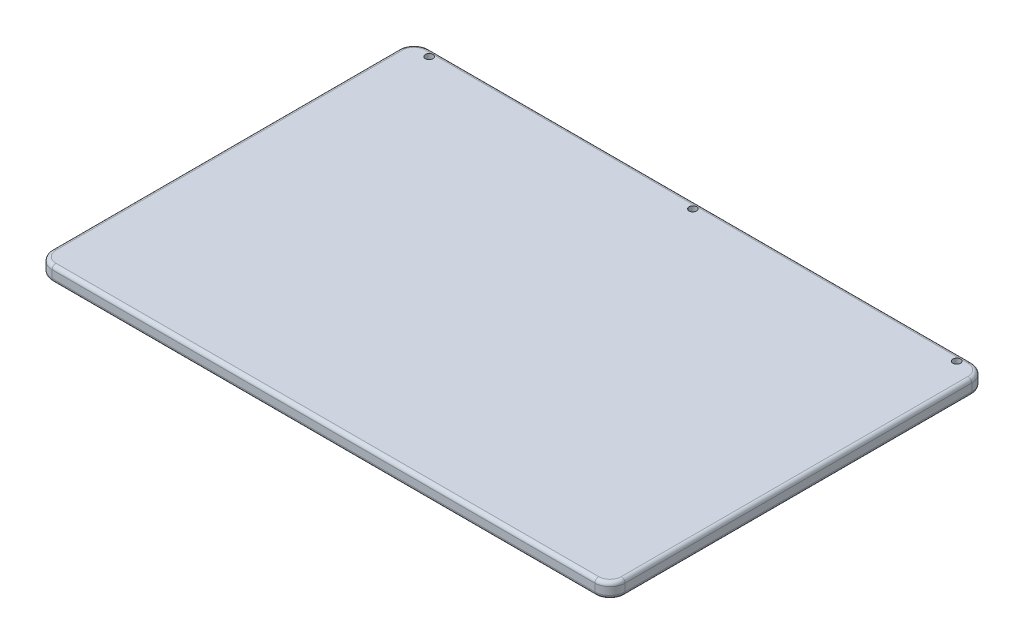
ISO-10303-21;
HEADER;
FILE_DESCRIPTION(('STEP AP214'),'2;1');
FILE_NAME('part.step','',(''),(''),'','','');
FILE_SCHEMA(('AUTOMOTIVE_DESIGN { 1 0 10303 214 1 1 1 1 }'));
ENDSEC;
DATA;
#1=APPLICATION_CONTEXT('core data for automotive mechanical design processes');
#2=APPLICATION_PROTOCOL_DEFINITION('international standard','automotive_design',2000,#1);
#3=PRODUCT_CONTEXT('',#1,'mechanical');
#4=PRODUCT('Part','Part','',(#3));
#5=PRODUCT_RELATED_PRODUCT_CATEGORY('part','',(#4));
#6=PRODUCT_DEFINITION_FORMATION('','',#4);
#7=PRODUCT_DEFINITION_CONTEXT('part definition',#1,'design');
#8=PRODUCT_DEFINITION('design','',#6,#7);
#9=PRODUCT_DEFINITION_SHAPE('','',#8);
#10=(LENGTH_UNIT() NAMED_UNIT(*) SI_UNIT(.MILLI.,.METRE.));
#11=(NAMED_UNIT(*) PLANE_ANGLE_UNIT() SI_UNIT($,.RADIAN.));
#12=(NAMED_UNIT(*) SI_UNIT($,.STERADIAN.) SOLID_ANGLE_UNIT());
#13=UNCERTAINTY_MEASURE_WITH_UNIT(LENGTH_MEASURE(1.E-05),#10,'distance_accuracy_value','');
#14=(GEOMETRIC_REPRESENTATION_CONTEXT(3) GLOBAL_UNCERTAINTY_ASSIGNED_CONTEXT((#13)) GLOBAL_UNIT_ASSIGNED_CONTEXT((#10,
#11,#12)) REPRESENTATION_CONTEXT('',''));
#15=CARTESIAN_POINT('',(0.,0.,0.));
#16=DIRECTION('',(0.,0.,1.));
#17=DIRECTION('',(1.,0.,0.));
#18=AXIS2_PLACEMENT_3D('',#15,#16,#17);
#19=CARTESIAN_POINT('',(190.,10.,125.));
#20=DIRECTION('',(-1.,0.,0.));
#21=DIRECTION('',(0.,0.,1.));
#22=AXIS2_PLACEMENT_3D('',#19,#20,#21);
#23=PLANE('',#22);
#24=DIRECTION('',(0.,0.,-1.));
#25=VECTOR('',#24,1.);
#26=CARTESIAN_POINT('',(190.,2.5,-125.));
#27=LINE('',#26,#25);
#28=CARTESIAN_POINT('',(190.,2.5,115.));
#29=VERTEX_POINT('',#28);
#30=CARTESIAN_POINT('',(190.,2.5,-115.));
#31=VERTEX_POINT('',#30);
#32=EDGE_CURVE('E44',#29,#31,#27,.T.);
#33=ORIENTED_EDGE('',*,*,#32,.T.);
#34=DIRECTION('',(0.,-1.,0.));
#35=VECTOR('',#34,1.);
#36=CARTESIAN_POINT('',(190.,10.,-115.));
#37=LINE('',#36,#35);
#38=CARTESIAN_POINT('',(190.,7.5,-115.));
#39=VERTEX_POINT('',#38);
#40=EDGE_CURVE('E12',#31,#39,#37,.F.);
#41=ORIENTED_EDGE('',*,*,#40,.T.);
#42=DIRECTION('',(0.,0.,-1.));
#43=VECTOR('',#42,1.);
#44=CARTESIAN_POINT('',(190.,7.5,125.));
#45=LINE('',#44,#43);
#46=CARTESIAN_POINT('',(190.,7.5,115.));
#47=VERTEX_POINT('',#46);
#48=EDGE_CURVE('E269',#39,#47,#45,.F.);
#49=ORIENTED_EDGE('',*,*,#48,.T.);
#50=DIRECTION('',(0.,-1.,0.));
#51=VECTOR('',#50,1.);
#52=CARTESIAN_POINT('',(190.,10.,115.));
#53=LINE('',#52,#51);
#54=EDGE_CURVE('E267',#47,#29,#53,.T.);
#55=ORIENTED_EDGE('',*,*,#54,.T.);
#56=EDGE_LOOP('',(#33,#41,#49,#55));
#57=FACE_BOUND('',#56,.T.);
#58=ADVANCED_FACE('F35',(#57),#23,.F.);
#59=CARTESIAN_POINT('',(-190.,10.,-125.));
#60=DIRECTION('',(0.,0.,1.));
#61=DIRECTION('',(1.,0.,0.));
#62=AXIS2_PLACEMENT_3D('',#59,#60,#61);
#63=PLANE('',#62);
#64=DIRECTION('',(-1.,0.,0.));
#65=VECTOR('',#64,1.);
#66=CARTESIAN_POINT('',(-190.,7.5,-125.));
#67=LINE('',#66,#65);
#68=CARTESIAN_POINT('',(-180.,7.5,-125.));
#69=VERTEX_POINT('',#68);
#70=CARTESIAN_POINT('',(180.,7.5,-125.));
#71=VERTEX_POINT('',#70);
#72=EDGE_CURVE('E260',#69,#71,#67,.F.);
#73=ORIENTED_EDGE('',*,*,#72,.T.);
#74=DIRECTION('',(0.,-1.,0.));
#75=VECTOR('',#74,1.);
#76=CARTESIAN_POINT('',(180.,10.,-125.));
#77=LINE('',#76,#75);
#78=CARTESIAN_POINT('',(180.,2.5,-125.));
#79=VERTEX_POINT('',#78);
#80=EDGE_CURVE('E265',#71,#79,#77,.T.);
#81=ORIENTED_EDGE('',*,*,#80,.T.);
#82=DIRECTION('',(-1.,0.,0.));
#83=VECTOR('',#82,1.);
#84=CARTESIAN_POINT('',(-190.,2.5,-125.));
#85=LINE('',#84,#83);
#86=CARTESIAN_POINT('',(-180.,2.5,-125.));
#87=VERTEX_POINT('',#86);
#88=EDGE_CURVE('E262',#79,#87,#85,.T.);
#89=ORIENTED_EDGE('',*,*,#88,.T.);
#90=DIRECTION('',(0.,-1.,0.));
#91=VECTOR('',#90,1.);
#92=CARTESIAN_POINT('',(-180.,10.,-125.));
#93=LINE('',#92,#91);
#94=EDGE_CURVE('E258',#87,#69,#93,.F.);
#95=ORIENTED_EDGE('',*,*,#94,.T.);
#96=EDGE_LOOP('',(#73,#81,#89,#95));
#97=FACE_BOUND('',#96,.T.);
#98=ADVANCED_FACE('F378',(#97),#63,.F.);
#99=CARTESIAN_POINT('',(-190.,10.,125.));
#100=DIRECTION('',(1.,0.,0.));
#101=DIRECTION('',(0.,0.,-1.));
#102=AXIS2_PLACEMENT_3D('',#99,#100,#101);
#103=PLANE('',#102);
#104=DIRECTION('',(0.,0.,1.));
#105=VECTOR('',#104,1.);
#106=CARTESIAN_POINT('',(-190.,7.5,125.));
#107=LINE('',#106,#105);
#108=CARTESIAN_POINT('',(-190.,7.5,115.));
#109=VERTEX_POINT('',#108);
#110=CARTESIAN_POINT('',(-190.,7.5,-115.));
#111=VERTEX_POINT('',#110);
#112=EDGE_CURVE('E251',#109,#111,#107,.F.);
#113=ORIENTED_EDGE('',*,*,#112,.T.);
#114=DIRECTION('',(0.,-1.,0.));
#115=VECTOR('',#114,1.);
#116=CARTESIAN_POINT('',(-190.,10.,-115.));
#117=LINE('',#116,#115);
#118=CARTESIAN_POINT('',(-190.,2.5,-115.));
#119=VERTEX_POINT('',#118);
#120=EDGE_CURVE('E256',#111,#119,#117,.T.);
#121=ORIENTED_EDGE('',*,*,#120,.T.);
#122=DIRECTION('',(0.,0.,1.));
#123=VECTOR('',#122,1.);
#124=CARTESIAN_POINT('',(-190.,2.5,125.));
#125=LINE('',#124,#123);
#126=CARTESIAN_POINT('',(-190.,2.5,115.));
#127=VERTEX_POINT('',#126);
#128=EDGE_CURVE('E253',#119,#127,#125,.T.);
#129=ORIENTED_EDGE('',*,*,#128,.T.);
#130=DIRECTION('',(0.,-1.,0.));
#131=VECTOR('',#130,1.);
#132=CARTESIAN_POINT('',(-190.,10.,115.));
#133=LINE('',#132,#131);
#134=EDGE_CURVE('E249',#127,#109,#133,.F.);
#135=ORIENTED_EDGE('',*,*,#134,.T.);
#136=EDGE_LOOP('',(#113,#121,#129,#135));
#137=FACE_BOUND('',#136,.T.);
#138=ADVANCED_FACE('F343',(#137),#103,.F.);
#139=CARTESIAN_POINT('',(-190.,10.,125.));
#140=DIRECTION('',(0.,0.,-1.));
#141=DIRECTION('',(-1.,0.,0.));
#142=AXIS2_PLACEMENT_3D('',#139,#140,#141);
#143=PLANE('',#142);
#144=DIRECTION('',(1.,0.,0.));
#145=VECTOR('',#144,1.);
#146=CARTESIAN_POINT('',(-190.,7.5,125.));
#147=LINE('',#146,#145);
#148=CARTESIAN_POINT('',(180.,7.5,125.));
#149=VERTEX_POINT('',#148);
#150=CARTESIAN_POINT('',(-180.,7.5,125.));
#151=VERTEX_POINT('',#150);
#152=EDGE_CURVE('E195',#149,#151,#147,.F.);
#153=ORIENTED_EDGE('',*,*,#152,.T.);
#154=DIRECTION('',(0.,-1.,0.));
#155=VECTOR('',#154,1.);
#156=CARTESIAN_POINT('',(-180.,10.,125.));
#157=LINE('',#156,#155);
#158=CARTESIAN_POINT('',(-180.,2.5,125.));
#159=VERTEX_POINT('',#158);
#160=EDGE_CURVE('E199',#151,#159,#157,.T.);
#161=ORIENTED_EDGE('',*,*,#160,.T.);
#162=DIRECTION('',(1.,0.,0.));
#163=VECTOR('',#162,1.);
#164=CARTESIAN_POINT('',(190.,2.5,125.));
#165=LINE('',#164,#163);
#166=CARTESIAN_POINT('',(180.,2.5,125.));
#167=VERTEX_POINT('',#166);
#168=EDGE_CURVE('E170',#159,#167,#165,.T.);
#169=ORIENTED_EDGE('',*,*,#168,.T.);
#170=DIRECTION('',(0.,-1.,0.));
#171=VECTOR('',#170,1.);
#172=CARTESIAN_POINT('',(180.,10.,125.));
#173=LINE('',#172,#171);
#174=EDGE_CURVE('E189',#167,#149,#173,.F.);
#175=ORIENTED_EDGE('',*,*,#174,.T.);
#176=EDGE_LOOP('',(#153,#161,#169,#175));
#177=FACE_BOUND('',#176,.T.);
#178=ADVANCED_FACE('F197',(#177),#143,.F.);
#179=CARTESIAN_POINT('',(0.,10.,0.));
#180=DIRECTION('',(0.,-1.,0.));
#181=DIRECTION('',(0.,0.,-1.));
#182=AXIS2_PLACEMENT_3D('',#179,#180,#181);
#183=PLANE('',#182);
#184=DIRECTION('',(-1.,0.,0.));
#185=VECTOR('',#184,1.);
#186=CARTESIAN_POINT('',(0.,10.,-122.5));
#187=LINE('',#186,#185);
#188=CARTESIAN_POINT('',(0.,10.,-122.5));
#189=VERTEX_POINT('',#188);
#190=CARTESIAN_POINT('',(-175.,10.,-122.5));
#191=VERTEX_POINT('',#190);
#192=EDGE_CURVE('E356',#189,#191,#187,.T.);
#193=ORIENTED_EDGE('',*,*,#192,.T.);
#194=CARTESIAN_POINT('',(-175.,10.,-120.));
#195=DIRECTION('',(0.,-1.,0.));
#196=DIRECTION('',(0.,0.,-1.));
#197=AXIS2_PLACEMENT_3D('',#194,#195,#196);
#198=CIRCLE('',#197,2.5);
#199=EDGE_CURVE('E50',#191,#191,#198,.T.);
#200=ORIENTED_EDGE('',*,*,#199,.T.);
#201=CARTESIAN_POINT('',(-180.,10.,-122.5));
#202=VERTEX_POINT('',#201);
#203=EDGE_CURVE('E231',#191,#202,#187,.T.);
#204=ORIENTED_EDGE('',*,*,#203,.T.);
#205=CARTESIAN_POINT('',(-180.,10.,-115.));
#206=DIRECTION('',(0.,-1.,0.));
#207=DIRECTION('',(0.,0.,-1.));
#208=AXIS2_PLACEMENT_3D('',#205,#206,#207);
#209=CIRCLE('',#208,7.5);
#210=CARTESIAN_POINT('',(-187.5,10.,-115.));
#211=VERTEX_POINT('',#210);
#212=EDGE_CURVE('E241',#211,#202,#209,.T.);
#213=ORIENTED_EDGE('',*,*,#212,.F.);
#214=DIRECTION('',(0.,0.,1.));
#215=VECTOR('',#214,1.);
#216=CARTESIAN_POINT('',(-187.5,10.,0.));
#217=LINE('',#216,#215);
#218=CARTESIAN_POINT('',(-187.5,10.,115.));
#219=VERTEX_POINT('',#218);
#220=EDGE_CURVE('E247',#211,#219,#217,.T.);
#221=ORIENTED_EDGE('',*,*,#220,.T.);
#222=CARTESIAN_POINT('',(-180.,10.,115.));
#223=DIRECTION('',(0.,-1.,0.));
#224=DIRECTION('',(0.,0.,-1.));
#225=AXIS2_PLACEMENT_3D('',#222,#223,#224);
#226=CIRCLE('',#225,7.5);
#227=CARTESIAN_POINT('',(-180.,10.,122.5));
#228=VERTEX_POINT('',#227);
#229=EDGE_CURVE('E244',#228,#219,#226,.T.);
#230=ORIENTED_EDGE('',*,*,#229,.F.);
#231=DIRECTION('',(1.,0.,0.));
#232=VECTOR('',#231,1.);
#233=CARTESIAN_POINT('',(0.,10.,122.5));
#234=LINE('',#233,#232);
#235=CARTESIAN_POINT('',(180.,10.,122.5));
#236=VERTEX_POINT('',#235);
#237=EDGE_CURVE('E238',#228,#236,#234,.T.);
#238=ORIENTED_EDGE('',*,*,#237,.T.);
#239=CARTESIAN_POINT('',(180.,10.,115.));
#240=DIRECTION('',(0.,-1.,0.));
#241=DIRECTION('',(0.,0.,-1.));
#242=AXIS2_PLACEMENT_3D('',#239,#240,#241);
#243=CIRCLE('',#242,7.5);
#244=CARTESIAN_POINT('',(187.5,10.,115.));
#245=VERTEX_POINT('',#244);
#246=EDGE_CURVE('E235',#245,#236,#243,.T.);
#247=ORIENTED_EDGE('',*,*,#246,.F.);
#248=DIRECTION('',(0.,0.,-1.));
#249=VECTOR('',#248,1.);
#250=CARTESIAN_POINT('',(187.5,10.,0.));
#251=LINE('',#250,#249);
#252=CARTESIAN_POINT('',(187.5,10.,-115.));
#253=VERTEX_POINT('',#252);
#254=EDGE_CURVE('E229',#245,#253,#251,.T.);
#255=ORIENTED_EDGE('',*,*,#254,.T.);
#256=CARTESIAN_POINT('',(180.,10.,-115.));
#257=DIRECTION('',(0.,-1.,0.));
#258=DIRECTION('',(0.,0.,-1.));
#259=AXIS2_PLACEMENT_3D('',#256,#257,#258);
#260=CIRCLE('',#259,7.5);
#261=CARTESIAN_POINT('',(180.,10.,-122.5));
#262=VERTEX_POINT('',#261);
#263=EDGE_CURVE('E226',#262,#253,#260,.T.);
#264=ORIENTED_EDGE('',*,*,#263,.F.);
#265=CARTESIAN_POINT('',(175.,10.,-122.5));
#266=VERTEX_POINT('',#265);
#267=EDGE_CURVE('E232',#262,#266,#187,.T.);
#268=ORIENTED_EDGE('',*,*,#267,.T.);
#269=CARTESIAN_POINT('',(175.,10.,-120.));
#270=DIRECTION('',(0.,-1.,0.));
#271=DIRECTION('',(0.,0.,-1.));
#272=AXIS2_PLACEMENT_3D('',#269,#270,#271);
#273=CIRCLE('',#272,2.5);
#274=EDGE_CURVE('E360',#266,#266,#273,.T.);
#275=ORIENTED_EDGE('',*,*,#274,.T.);
#276=EDGE_CURVE('E236',#266,#189,#187,.T.);
#277=ORIENTED_EDGE('',*,*,#276,.T.);
#278=CARTESIAN_POINT('',(0.,10.,-120.));
#279=DIRECTION('',(0.,-1.,0.));
#280=DIRECTION('',(0.,0.,-1.));
#281=AXIS2_PLACEMENT_3D('',#278,#279,#280);
#282=CIRCLE('',#281,2.5);
#283=EDGE_CURVE('E55',#189,#189,#282,.T.);
#284=ORIENTED_EDGE('',*,*,#283,.T.);
#285=EDGE_LOOP('',(#193,#200,#204,#213,#221,#230,#238,#247,#255,#264,#268,#275,#277,#284));
#286=FACE_BOUND('',#285,.T.);
#287=ADVANCED_FACE('F353',(#286),#183,.F.);
#288=CARTESIAN_POINT('',(0.,0.,0.));
#289=DIRECTION('',(0.,-1.,0.));
#290=DIRECTION('',(0.,0.,-1.));
#291=AXIS2_PLACEMENT_3D('',#288,#289,#290);
#292=PLANE('',#291);
#293=DIRECTION('',(-1.,0.,0.));
#294=VECTOR('',#293,1.);
#295=CARTESIAN_POINT('',(190.,0.,-122.5));
#296=LINE('',#295,#294);
#297=CARTESIAN_POINT('',(-180.,0.,-122.5));
#298=VERTEX_POINT('',#297);
#299=CARTESIAN_POINT('',(-175.,0.,-122.5));
#300=VERTEX_POINT('',#299);
#301=EDGE_CURVE('E213',#298,#300,#296,.F.);
#302=ORIENTED_EDGE('',*,*,#301,.T.);
#303=CARTESIAN_POINT('',(-175.,0.,-120.));
#304=DIRECTION('',(0.,-1.,0.));
#305=DIRECTION('',(0.,0.,-1.));
#306=AXIS2_PLACEMENT_3D('',#303,#304,#305);
#307=CIRCLE('',#306,2.5);
#308=EDGE_CURVE('E639',#300,#300,#307,.T.);
#309=ORIENTED_EDGE('',*,*,#308,.F.);
#310=CARTESIAN_POINT('',(0.,0.,-122.5));
#311=VERTEX_POINT('',#310);
#312=EDGE_CURVE('E217',#300,#311,#296,.F.);
#313=ORIENTED_EDGE('',*,*,#312,.T.);
#314=CARTESIAN_POINT('',(0.,0.,-120.));
#315=DIRECTION('',(0.,-1.,0.));
#316=DIRECTION('',(0.,0.,-1.));
#317=AXIS2_PLACEMENT_3D('',#314,#315,#316);
#318=CIRCLE('',#317,2.5);
#319=EDGE_CURVE('E648',#311,#311,#318,.T.);
#320=ORIENTED_EDGE('',*,*,#319,.F.);
#321=CARTESIAN_POINT('',(175.,0.,-122.5));
#322=VERTEX_POINT('',#321);
#323=EDGE_CURVE('E646',#311,#322,#296,.F.);
#324=ORIENTED_EDGE('',*,*,#323,.T.);
#325=CARTESIAN_POINT('',(175.,0.,-120.));
#326=DIRECTION('',(0.,-1.,0.));
#327=DIRECTION('',(0.,0.,-1.));
#328=AXIS2_PLACEMENT_3D('',#325,#326,#327);
#329=CIRCLE('',#328,2.5);
#330=EDGE_CURVE('E644',#322,#322,#329,.T.);
#331=ORIENTED_EDGE('',*,*,#330,.F.);
#332=CARTESIAN_POINT('',(180.,0.,-122.5));
#333=VERTEX_POINT('',#332);
#334=EDGE_CURVE('E212',#322,#333,#296,.F.);
#335=ORIENTED_EDGE('',*,*,#334,.T.);
#336=CARTESIAN_POINT('',(180.,0.,-115.));
#337=DIRECTION('',(0.,-1.,0.));
#338=DIRECTION('',(0.,0.,-1.));
#339=AXIS2_PLACEMENT_3D('',#336,#337,#338);
#340=CIRCLE('',#339,7.5);
#341=CARTESIAN_POINT('',(187.5,0.,-115.));
#342=VERTEX_POINT('',#341);
#343=EDGE_CURVE('E209',#342,#333,#340,.F.);
#344=ORIENTED_EDGE('',*,*,#343,.F.);
#345=DIRECTION('',(0.,0.,-1.));
#346=VECTOR('',#345,1.);
#347=CARTESIAN_POINT('',(187.5,0.,125.));
#348=LINE('',#347,#346);
#349=CARTESIAN_POINT('',(187.5,0.,115.));
#350=VERTEX_POINT('',#349);
#351=EDGE_CURVE('E207',#342,#350,#348,.F.);
#352=ORIENTED_EDGE('',*,*,#351,.T.);
#353=CARTESIAN_POINT('',(180.,0.,115.));
#354=DIRECTION('',(0.,-1.,0.));
#355=DIRECTION('',(0.,0.,-1.));
#356=AXIS2_PLACEMENT_3D('',#353,#354,#355);
#357=CIRCLE('',#356,7.5);
#358=CARTESIAN_POINT('',(180.,0.,122.5));
#359=VERTEX_POINT('',#358);
#360=EDGE_CURVE('E202',#359,#350,#357,.F.);
#361=ORIENTED_EDGE('',*,*,#360,.F.);
#362=DIRECTION('',(1.,0.,0.));
#363=VECTOR('',#362,1.);
#364=CARTESIAN_POINT('',(-190.,0.,122.5));
#365=LINE('',#364,#363);
#366=CARTESIAN_POINT('',(-180.,0.,122.5));
#367=VERTEX_POINT('',#366);
#368=EDGE_CURVE('E172',#359,#367,#365,.F.);
#369=ORIENTED_EDGE('',*,*,#368,.T.);
#370=CARTESIAN_POINT('',(-180.,0.,115.));
#371=DIRECTION('',(0.,-1.,0.));
#372=DIRECTION('',(0.,0.,-1.));
#373=AXIS2_PLACEMENT_3D('',#370,#371,#372);
#374=CIRCLE('',#373,7.5);
#375=CARTESIAN_POINT('',(-187.5,0.,115.));
#376=VERTEX_POINT('',#375);
#377=EDGE_CURVE('E222',#376,#367,#374,.F.);
#378=ORIENTED_EDGE('',*,*,#377,.F.);
#379=DIRECTION('',(0.,0.,1.));
#380=VECTOR('',#379,1.);
#381=CARTESIAN_POINT('',(-187.5,0.,-125.));
#382=LINE('',#381,#380);
#383=CARTESIAN_POINT('',(-187.5,0.,-115.));
#384=VERTEX_POINT('',#383);
#385=EDGE_CURVE('E220',#376,#384,#382,.F.);
#386=ORIENTED_EDGE('',*,*,#385,.T.);
#387=CARTESIAN_POINT('',(-180.,0.,-115.));
#388=DIRECTION('',(0.,-1.,0.));
#389=DIRECTION('',(0.,0.,-1.));
#390=AXIS2_PLACEMENT_3D('',#387,#388,#389);
#391=CIRCLE('',#390,7.5);
#392=EDGE_CURVE('E216',#298,#384,#391,.F.);
#393=ORIENTED_EDGE('',*,*,#392,.F.);
#394=EDGE_LOOP('',(#302,#309,#313,#320,#324,#331,#335,#344,#352,#361,#369,#378,#386,#393));
#395=FACE_BOUND('',#394,.T.);
#396=ADVANCED_FACE('F594',(#395),#292,.T.);
#397=CARTESIAN_POINT('',(0.,7.5,-122.5));
#398=DIRECTION('',(-1.,0.,0.));
#399=DIRECTION('',(0.,0.,1.));
#400=AXIS2_PLACEMENT_3D('',#397,#398,#399);
#401=CYLINDRICAL_SURFACE('',#400,2.5);
#402=CARTESIAN_POINT('',(-180.,7.5,-122.5));
#403=DIRECTION('',(-1.,0.,0.));
#404=DIRECTION('',(0.,0.,1.));
#405=AXIS2_PLACEMENT_3D('',#402,#403,#404);
#406=CIRCLE('',#405,2.5);
#407=EDGE_CURVE('E39',#202,#69,#406,.T.);
#408=ORIENTED_EDGE('',*,*,#407,.F.);
#409=ORIENTED_EDGE('',*,*,#203,.F.);
#410=ORIENTED_EDGE('',*,*,#192,.F.);
#411=ORIENTED_EDGE('',*,*,#276,.F.);
#412=ORIENTED_EDGE('',*,*,#267,.F.);
#413=CARTESIAN_POINT('',(180.,7.5,-122.5));
#414=DIRECTION('',(1.,0.,0.));
#415=DIRECTION('',(0.,0.,-1.));
#416=AXIS2_PLACEMENT_3D('',#413,#414,#415);
#417=CIRCLE('',#416,2.5);
#418=EDGE_CURVE('E322',#71,#262,#417,.T.);
#419=ORIENTED_EDGE('',*,*,#418,.F.);
#420=ORIENTED_EDGE('',*,*,#72,.F.);
#421=EDGE_LOOP('',(#408,#409,#410,#411,#412,#419,#420));
#422=FACE_BOUND('',#421,.T.);
#423=ADVANCED_FACE('F37',(#422),#401,.T.);
#424=CARTESIAN_POINT('',(-180.,7.5,-115.));
#425=DIRECTION('',(0.,-1.,0.));
#426=DIRECTION('',(0.,0.,-1.));
#427=AXIS2_PLACEMENT_3D('',#424,#425,#426);
#428=TOROIDAL_SURFACE('',#427,7.5,2.5);
#429=ORIENTED_EDGE('',*,*,#212,.T.);
#430=ORIENTED_EDGE('',*,*,#407,.T.);
#431=CARTESIAN_POINT('',(-180.,7.5,-115.));
#432=DIRECTION('',(0.,-1.,0.));
#433=DIRECTION('',(0.,0.,-1.));
#434=AXIS2_PLACEMENT_3D('',#431,#432,#433);
#435=CIRCLE('',#434,10.);
#436=EDGE_CURVE('E320',#111,#69,#435,.T.);
#437=ORIENTED_EDGE('',*,*,#436,.F.);
#438=CARTESIAN_POINT('',(-187.5,7.5,-115.));
#439=DIRECTION('',(0.,0.,-1.));
#440=DIRECTION('',(-1.,0.,0.));
#441=AXIS2_PLACEMENT_3D('',#438,#439,#440);
#442=CIRCLE('',#441,2.5);
#443=EDGE_CURVE('E317',#211,#111,#442,.F.);
#444=ORIENTED_EDGE('',*,*,#443,.F.);
#445=EDGE_LOOP('',(#429,#430,#437,#444));
#446=FACE_BOUND('',#445,.T.);
#447=ADVANCED_FACE('F331',(#446),#428,.T.);
#448=CARTESIAN_POINT('',(180.,7.5,-115.));
#449=DIRECTION('',(0.,-1.,0.));
#450=DIRECTION('',(0.,0.,-1.));
#451=AXIS2_PLACEMENT_3D('',#448,#449,#450);
#452=TOROIDAL_SURFACE('',#451,7.5,2.5);
#453=ORIENTED_EDGE('',*,*,#418,.T.);
#454=ORIENTED_EDGE('',*,*,#263,.T.);
#455=CARTESIAN_POINT('',(187.5,7.5,-115.));
#456=DIRECTION('',(0.,0.,-1.));
#457=DIRECTION('',(-1.,0.,0.));
#458=AXIS2_PLACEMENT_3D('',#455,#456,#457);
#459=CIRCLE('',#458,2.5);
#460=EDGE_CURVE('E314',#39,#253,#459,.F.);
#461=ORIENTED_EDGE('',*,*,#460,.F.);
#462=CARTESIAN_POINT('',(180.,7.5,-115.));
#463=DIRECTION('',(0.,-1.,0.));
#464=DIRECTION('',(0.,0.,-1.));
#465=AXIS2_PLACEMENT_3D('',#462,#463,#464);
#466=CIRCLE('',#465,10.);
#467=EDGE_CURVE('E311',#71,#39,#466,.T.);
#468=ORIENTED_EDGE('',*,*,#467,.F.);
#469=EDGE_LOOP('',(#453,#454,#461,#468));
#470=FACE_BOUND('',#469,.T.);
#471=ADVANCED_FACE('F364',(#470),#452,.T.);
#472=CARTESIAN_POINT('',(-180.,10.,-115.));
#473=DIRECTION('',(0.,-1.,0.));
#474=DIRECTION('',(0.,0.,-1.));
#475=AXIS2_PLACEMENT_3D('',#472,#473,#474);
#476=CYLINDRICAL_SURFACE('',#475,10.);
#477=ORIENTED_EDGE('',*,*,#436,.T.);
#478=ORIENTED_EDGE('',*,*,#94,.F.);
#479=CARTESIAN_POINT('',(-180.,2.5,-115.));
#480=DIRECTION('',(0.,-1.,0.));
#481=DIRECTION('',(0.,0.,-1.));
#482=AXIS2_PLACEMENT_3D('',#479,#480,#481);
#483=CIRCLE('',#482,10.);
#484=EDGE_CURVE('E306',#119,#87,#483,.T.);
#485=ORIENTED_EDGE('',*,*,#484,.F.);
#486=ORIENTED_EDGE('',*,*,#120,.F.);
#487=EDGE_LOOP('',(#477,#478,#485,#486));
#488=FACE_BOUND('',#487,.T.);
#489=ADVANCED_FACE('F339',(#488),#476,.T.);
#490=CARTESIAN_POINT('',(-187.5,7.5,0.));
#491=DIRECTION('',(0.,0.,1.));
#492=DIRECTION('',(1.,0.,0.));
#493=AXIS2_PLACEMENT_3D('',#490,#491,#492);
#494=CYLINDRICAL_SURFACE('',#493,2.5);
#495=ORIENTED_EDGE('',*,*,#443,.T.);
#496=ORIENTED_EDGE('',*,*,#112,.F.);
#497=CARTESIAN_POINT('',(-187.5,7.5,115.));
#498=DIRECTION('',(0.,0.,1.));
#499=DIRECTION('',(1.,0.,0.));
#500=AXIS2_PLACEMENT_3D('',#497,#498,#499);
#501=CIRCLE('',#500,2.5);
#502=EDGE_CURVE('E303',#219,#109,#501,.T.);
#503=ORIENTED_EDGE('',*,*,#502,.F.);
#504=ORIENTED_EDGE('',*,*,#220,.F.);
#505=EDGE_LOOP('',(#495,#496,#503,#504));
#506=FACE_BOUND('',#505,.T.);
#507=ADVANCED_FACE('F350',(#506),#494,.T.);
#508=CARTESIAN_POINT('',(0.,7.5,122.5));
#509=DIRECTION('',(1.,0.,0.));
#510=DIRECTION('',(0.,0.,-1.));
#511=AXIS2_PLACEMENT_3D('',#508,#509,#510);
#512=CYLINDRICAL_SURFACE('',#511,2.5);
#513=CARTESIAN_POINT('',(180.,7.5,122.5));
#514=DIRECTION('',(1.,0.,0.));
#515=DIRECTION('',(0.,0.,-1.));
#516=AXIS2_PLACEMENT_3D('',#513,#514,#515);
#517=CIRCLE('',#516,2.5);
#518=EDGE_CURVE('E297',#236,#149,#517,.T.);
#519=ORIENTED_EDGE('',*,*,#518,.F.);
#520=ORIENTED_EDGE('',*,*,#237,.F.);
#521=CARTESIAN_POINT('',(-180.,7.5,122.5));
#522=DIRECTION('',(-1.,0.,0.));
#523=DIRECTION('',(0.,0.,1.));
#524=AXIS2_PLACEMENT_3D('',#521,#522,#523);
#525=CIRCLE('',#524,2.5);
#526=EDGE_CURVE('E300',#151,#228,#525,.T.);
#527=ORIENTED_EDGE('',*,*,#526,.F.);
#528=ORIENTED_EDGE('',*,*,#152,.F.);
#529=EDGE_LOOP('',(#519,#520,#527,#528));
#530=FACE_BOUND('',#529,.T.);
#531=ADVANCED_FACE('F402',(#530),#512,.T.);
#532=CARTESIAN_POINT('',(187.5,7.5,0.));
#533=DIRECTION('',(0.,0.,-1.));
#534=DIRECTION('',(-1.,0.,0.));
#535=AXIS2_PLACEMENT_3D('',#532,#533,#534);
#536=CYLINDRICAL_SURFACE('',#535,2.5);
#537=ORIENTED_EDGE('',*,*,#460,.T.);
#538=ORIENTED_EDGE('',*,*,#254,.F.);
#539=CARTESIAN_POINT('',(187.5,7.5,115.));
#540=DIRECTION('',(0.,0.,1.));
#541=DIRECTION('',(1.,0.,0.));
#542=AXIS2_PLACEMENT_3D('',#539,#540,#541);
#543=CIRCLE('',#542,2.5);
#544=EDGE_CURVE('E294',#47,#245,#543,.T.);
#545=ORIENTED_EDGE('',*,*,#544,.F.);
#546=ORIENTED_EDGE('',*,*,#48,.F.);
#547=EDGE_LOOP('',(#537,#538,#545,#546));
#548=FACE_BOUND('',#547,.T.);
#549=ADVANCED_FACE('F367',(#548),#536,.T.);
#550=CARTESIAN_POINT('',(180.,10.,-115.));
#551=DIRECTION('',(0.,-1.,0.));
#552=DIRECTION('',(0.,0.,-1.));
#553=AXIS2_PLACEMENT_3D('',#550,#551,#552);
#554=CYLINDRICAL_SURFACE('',#553,10.);
#555=ORIENTED_EDGE('',*,*,#467,.T.);
#556=ORIENTED_EDGE('',*,*,#40,.F.);
#557=CARTESIAN_POINT('',(180.,2.5,-115.));
#558=DIRECTION('',(0.,-1.,0.));
#559=DIRECTION('',(0.,0.,-1.));
#560=AXIS2_PLACEMENT_3D('',#557,#558,#559);
#561=CIRCLE('',#560,10.);
#562=EDGE_CURVE('E291',#79,#31,#561,.T.);
#563=ORIENTED_EDGE('',*,*,#562,.F.);
#564=ORIENTED_EDGE('',*,*,#80,.F.);
#565=EDGE_LOOP('',(#555,#556,#563,#564));
#566=FACE_BOUND('',#565,.T.);
#567=ADVANCED_FACE('F375',(#566),#554,.T.);
#568=CARTESIAN_POINT('',(-190.,2.5,-122.5));
#569=DIRECTION('',(1.,0.,0.));
#570=DIRECTION('',(0.,0.,-1.));
#571=AXIS2_PLACEMENT_3D('',#568,#569,#570);
#572=CYLINDRICAL_SURFACE('',#571,2.5);
#573=CARTESIAN_POINT('',(180.,2.5,-122.5));
#574=DIRECTION('',(1.,0.,0.));
#575=DIRECTION('',(0.,0.,-1.));
#576=AXIS2_PLACEMENT_3D('',#573,#574,#575);
#577=CIRCLE('',#576,2.5);
#578=EDGE_CURVE('E288',#333,#79,#577,.T.);
#579=ORIENTED_EDGE('',*,*,#578,.F.);
#580=ORIENTED_EDGE('',*,*,#334,.F.);
#581=ORIENTED_EDGE('',*,*,#323,.F.);
#582=ORIENTED_EDGE('',*,*,#312,.F.);
#583=ORIENTED_EDGE('',*,*,#301,.F.);
#584=CARTESIAN_POINT('',(-180.,2.5,-122.5));
#585=DIRECTION('',(-1.,0.,0.));
#586=DIRECTION('',(0.,0.,1.));
#587=AXIS2_PLACEMENT_3D('',#584,#585,#586);
#588=CIRCLE('',#587,2.5);
#589=EDGE_CURVE('E308',#87,#298,#588,.T.);
#590=ORIENTED_EDGE('',*,*,#589,.F.);
#591=ORIENTED_EDGE('',*,*,#88,.F.);
#592=EDGE_LOOP('',(#579,#580,#581,#582,#583,#590,#591));
#593=FACE_BOUND('',#592,.T.);
#594=ADVANCED_FACE('F382',(#593),#572,.T.);
#595=CARTESIAN_POINT('',(-180.,2.5,-115.));
#596=DIRECTION('',(0.,-1.,0.));
#597=DIRECTION('',(0.,0.,-1.));
#598=AXIS2_PLACEMENT_3D('',#595,#596,#597);
#599=TOROIDAL_SURFACE('',#598,7.5,2.5);
#600=ORIENTED_EDGE('',*,*,#589,.T.);
#601=ORIENTED_EDGE('',*,*,#392,.T.);
#602=CARTESIAN_POINT('',(-187.5,2.5,-115.));
#603=DIRECTION('',(0.,0.,-1.));
#604=DIRECTION('',(-1.,0.,0.));
#605=AXIS2_PLACEMENT_3D('',#602,#603,#604);
#606=CIRCLE('',#605,2.5);
#607=EDGE_CURVE('E285',#119,#384,#606,.F.);
#608=ORIENTED_EDGE('',*,*,#607,.F.);
#609=ORIENTED_EDGE('',*,*,#484,.T.);
#610=EDGE_LOOP('',(#600,#601,#608,#609));
#611=FACE_BOUND('',#610,.T.);
#612=ADVANCED_FACE('F387',(#611),#599,.T.);
#613=CARTESIAN_POINT('',(-180.,7.5,115.));
#614=DIRECTION('',(0.,-1.,0.));
#615=DIRECTION('',(0.,0.,-1.));
#616=AXIS2_PLACEMENT_3D('',#613,#614,#615);
#617=TOROIDAL_SURFACE('',#616,7.5,2.5);
#618=ORIENTED_EDGE('',*,*,#229,.T.);
#619=ORIENTED_EDGE('',*,*,#502,.T.);
#620=CARTESIAN_POINT('',(-180.,7.5,115.));
#621=DIRECTION('',(0.,-1.,0.));
#622=DIRECTION('',(0.,0.,-1.));
#623=AXIS2_PLACEMENT_3D('',#620,#621,#622);
#624=CIRCLE('',#623,10.);
#625=EDGE_CURVE('E282',#151,#109,#624,.T.);
#626=ORIENTED_EDGE('',*,*,#625,.F.);
#627=ORIENTED_EDGE('',*,*,#526,.T.);
#628=EDGE_LOOP('',(#618,#619,#626,#627));
#629=FACE_BOUND('',#628,.T.);
#630=ADVANCED_FACE('F398',(#629),#617,.T.);
#631=CARTESIAN_POINT('',(180.,7.5,115.));
#632=DIRECTION('',(0.,-1.,0.));
#633=DIRECTION('',(0.,0.,-1.));
#634=AXIS2_PLACEMENT_3D('',#631,#632,#633);
#635=TOROIDAL_SURFACE('',#634,7.5,2.5);
#636=ORIENTED_EDGE('',*,*,#246,.T.);
#637=ORIENTED_EDGE('',*,*,#518,.T.);
#638=CARTESIAN_POINT('',(180.,7.5,115.));
#639=DIRECTION('',(0.,-1.,0.));
#640=DIRECTION('',(0.,0.,-1.));
#641=AXIS2_PLACEMENT_3D('',#638,#639,#640);
#642=CIRCLE('',#641,10.);
#643=EDGE_CURVE('E192',#47,#149,#642,.T.);
#644=ORIENTED_EDGE('',*,*,#643,.F.);
#645=ORIENTED_EDGE('',*,*,#544,.T.);
#646=EDGE_LOOP('',(#636,#637,#644,#645));
#647=FACE_BOUND('',#646,.T.);
#648=ADVANCED_FACE('F404',(#647),#635,.T.);
#649=CARTESIAN_POINT('',(180.,2.5,-115.));
#650=DIRECTION('',(0.,-1.,0.));
#651=DIRECTION('',(0.,0.,-1.));
#652=AXIS2_PLACEMENT_3D('',#649,#650,#651);
#653=TOROIDAL_SURFACE('',#652,7.5,2.5);
#654=ORIENTED_EDGE('',*,*,#578,.T.);
#655=ORIENTED_EDGE('',*,*,#562,.T.);
#656=CARTESIAN_POINT('',(187.5,2.5,-115.));
#657=DIRECTION('',(0.,0.,-1.));
#658=DIRECTION('',(-1.,0.,0.));
#659=AXIS2_PLACEMENT_3D('',#656,#657,#658);
#660=CIRCLE('',#659,2.5);
#661=EDGE_CURVE('E279',#342,#31,#660,.F.);
#662=ORIENTED_EDGE('',*,*,#661,.F.);
#663=ORIENTED_EDGE('',*,*,#343,.T.);
#664=EDGE_LOOP('',(#654,#655,#662,#663));
#665=FACE_BOUND('',#664,.T.);
#666=ADVANCED_FACE('F406',(#665),#653,.T.);
#667=CARTESIAN_POINT('',(-187.5,2.5,125.));
#668=DIRECTION('',(0.,0.,-1.));
#669=DIRECTION('',(-1.,0.,0.));
#670=AXIS2_PLACEMENT_3D('',#667,#668,#669);
#671=CYLINDRICAL_SURFACE('',#670,2.5);
#672=ORIENTED_EDGE('',*,*,#607,.T.);
#673=ORIENTED_EDGE('',*,*,#385,.F.);
#674=CARTESIAN_POINT('',(-187.5,2.5,115.));
#675=DIRECTION('',(0.,0.,1.));
#676=DIRECTION('',(1.,0.,0.));
#677=AXIS2_PLACEMENT_3D('',#674,#675,#676);
#678=CIRCLE('',#677,2.5);
#679=EDGE_CURVE('E276',#127,#376,#678,.T.);
#680=ORIENTED_EDGE('',*,*,#679,.F.);
#681=ORIENTED_EDGE('',*,*,#128,.F.);
#682=EDGE_LOOP('',(#672,#673,#680,#681));
#683=FACE_BOUND('',#682,.T.);
#684=ADVANCED_FACE('F391',(#683),#671,.T.);
#685=CARTESIAN_POINT('',(-180.,10.,115.));
#686=DIRECTION('',(0.,-1.,0.));
#687=DIRECTION('',(0.,0.,-1.));
#688=AXIS2_PLACEMENT_3D('',#685,#686,#687);
#689=CYLINDRICAL_SURFACE('',#688,10.);
#690=ORIENTED_EDGE('',*,*,#625,.T.);
#691=ORIENTED_EDGE('',*,*,#134,.F.);
#692=CARTESIAN_POINT('',(-180.,2.5,115.));
#693=DIRECTION('',(0.,-1.,0.));
#694=DIRECTION('',(0.,0.,-1.));
#695=AXIS2_PLACEMENT_3D('',#692,#693,#694);
#696=CIRCLE('',#695,10.);
#697=EDGE_CURVE('E186',#159,#127,#696,.T.);
#698=ORIENTED_EDGE('',*,*,#697,.F.);
#699=ORIENTED_EDGE('',*,*,#160,.F.);
#700=EDGE_LOOP('',(#690,#691,#698,#699));
#701=FACE_BOUND('',#700,.T.);
#702=ADVANCED_FACE('F394',(#701),#689,.T.);
#703=CARTESIAN_POINT('',(180.,10.,115.));
#704=DIRECTION('',(0.,-1.,0.));
#705=DIRECTION('',(0.,0.,-1.));
#706=AXIS2_PLACEMENT_3D('',#703,#704,#705);
#707=CYLINDRICAL_SURFACE('',#706,10.);
#708=ORIENTED_EDGE('',*,*,#643,.T.);
#709=ORIENTED_EDGE('',*,*,#174,.F.);
#710=CARTESIAN_POINT('',(180.,2.5,115.));
#711=DIRECTION('',(0.,-1.,0.));
#712=DIRECTION('',(0.,0.,-1.));
#713=AXIS2_PLACEMENT_3D('',#710,#711,#712);
#714=CIRCLE('',#713,10.);
#715=EDGE_CURVE('E179',#29,#167,#714,.T.);
#716=ORIENTED_EDGE('',*,*,#715,.F.);
#717=ORIENTED_EDGE('',*,*,#54,.F.);
#718=EDGE_LOOP('',(#708,#709,#716,#717));
#719=FACE_BOUND('',#718,.T.);
#720=ADVANCED_FACE('F190',(#719),#707,.T.);
#721=CARTESIAN_POINT('',(187.5,2.5,125.));
#722=DIRECTION('',(0.,0.,1.));
#723=DIRECTION('',(1.,0.,0.));
#724=AXIS2_PLACEMENT_3D('',#721,#722,#723);
#725=CYLINDRICAL_SURFACE('',#724,2.5);
#726=ORIENTED_EDGE('',*,*,#661,.T.);
#727=ORIENTED_EDGE('',*,*,#32,.F.);
#728=CARTESIAN_POINT('',(187.5,2.5,115.));
#729=DIRECTION('',(0.,0.,1.));
#730=DIRECTION('',(1.,0.,0.));
#731=AXIS2_PLACEMENT_3D('',#728,#729,#730);
#732=CIRCLE('',#731,2.5);
#733=EDGE_CURVE('E183',#350,#29,#732,.T.);
#734=ORIENTED_EDGE('',*,*,#733,.F.);
#735=ORIENTED_EDGE('',*,*,#351,.F.);
#736=EDGE_LOOP('',(#726,#727,#734,#735));
#737=FACE_BOUND('',#736,.T.);
#738=ADVANCED_FACE('F431',(#737),#725,.T.);
#739=CARTESIAN_POINT('',(-180.,2.5,115.));
#740=DIRECTION('',(0.,-1.,0.));
#741=DIRECTION('',(0.,0.,-1.));
#742=AXIS2_PLACEMENT_3D('',#739,#740,#741);
#743=TOROIDAL_SURFACE('',#742,7.5,2.5);
#744=ORIENTED_EDGE('',*,*,#679,.T.);
#745=ORIENTED_EDGE('',*,*,#377,.T.);
#746=CARTESIAN_POINT('',(-180.,2.5,122.5));
#747=DIRECTION('',(-1.,0.,0.));
#748=DIRECTION('',(0.,0.,1.));
#749=AXIS2_PLACEMENT_3D('',#746,#747,#748);
#750=CIRCLE('',#749,2.5);
#751=EDGE_CURVE('E175',#159,#367,#750,.F.);
#752=ORIENTED_EDGE('',*,*,#751,.F.);
#753=ORIENTED_EDGE('',*,*,#697,.T.);
#754=EDGE_LOOP('',(#744,#745,#752,#753));
#755=FACE_BOUND('',#754,.T.);
#756=ADVANCED_FACE('F428',(#755),#743,.T.);
#757=CARTESIAN_POINT('',(180.,2.5,115.));
#758=DIRECTION('',(0.,-1.,0.));
#759=DIRECTION('',(0.,0.,-1.));
#760=AXIS2_PLACEMENT_3D('',#757,#758,#759);
#761=TOROIDAL_SURFACE('',#760,7.5,2.5);
#762=ORIENTED_EDGE('',*,*,#733,.T.);
#763=ORIENTED_EDGE('',*,*,#715,.T.);
#764=CARTESIAN_POINT('',(180.,2.5,122.5));
#765=DIRECTION('',(1.,0.,0.));
#766=DIRECTION('',(0.,0.,-1.));
#767=AXIS2_PLACEMENT_3D('',#764,#765,#766);
#768=CIRCLE('',#767,2.5);
#769=EDGE_CURVE('E166',#359,#167,#768,.F.);
#770=ORIENTED_EDGE('',*,*,#769,.F.);
#771=ORIENTED_EDGE('',*,*,#360,.T.);
#772=EDGE_LOOP('',(#762,#763,#770,#771));
#773=FACE_BOUND('',#772,.T.);
#774=ADVANCED_FACE('F181',(#773),#761,.T.);
#775=CARTESIAN_POINT('',(-190.,2.5,122.5));
#776=DIRECTION('',(-1.,0.,0.));
#777=DIRECTION('',(0.,0.,1.));
#778=AXIS2_PLACEMENT_3D('',#775,#776,#777);
#779=CYLINDRICAL_SURFACE('',#778,2.5);
#780=ORIENTED_EDGE('',*,*,#751,.T.);
#781=ORIENTED_EDGE('',*,*,#368,.F.);
#782=ORIENTED_EDGE('',*,*,#769,.T.);
#783=ORIENTED_EDGE('',*,*,#168,.F.);
#784=EDGE_LOOP('',(#780,#781,#782,#783));
#785=FACE_BOUND('',#784,.T.);
#786=ADVANCED_FACE('F168',(#785),#779,.T.);
#787=CARTESIAN_POINT('',(175.,10.,-120.));
#788=DIRECTION('',(0.,-1.,0.));
#789=DIRECTION('',(0.,0.,-1.));
#790=AXIS2_PLACEMENT_3D('',#787,#788,#789);
#791=CYLINDRICAL_SURFACE('',#790,2.5);
#792=ORIENTED_EDGE('',*,*,#274,.F.);
#793=EDGE_LOOP('',(#792));
#794=FACE_BOUND('',#793,.T.);
#795=ORIENTED_EDGE('',*,*,#330,.T.);
#796=EDGE_LOOP('',(#795));
#797=FACE_BOUND('',#796,.T.);
#798=ADVANCED_FACE('F425',(#794,#797),#791,.F.);
#799=CARTESIAN_POINT('',(0.,10.,-120.));
#800=DIRECTION('',(0.,-1.,0.));
#801=DIRECTION('',(0.,0.,-1.));
#802=AXIS2_PLACEMENT_3D('',#799,#800,#801);
#803=CYLINDRICAL_SURFACE('',#802,2.5);
#804=ORIENTED_EDGE('',*,*,#283,.F.);
#805=EDGE_LOOP('',(#804));
#806=FACE_BOUND('',#805,.T.);
#807=ORIENTED_EDGE('',*,*,#319,.T.);
#808=EDGE_LOOP('',(#807));
#809=FACE_BOUND('',#808,.T.);
#810=ADVANCED_FACE('F475',(#806,#809),#803,.F.);
#811=CARTESIAN_POINT('',(-175.,10.,-120.));
#812=DIRECTION('',(0.,-1.,0.));
#813=DIRECTION('',(0.,0.,-1.));
#814=AXIS2_PLACEMENT_3D('',#811,#812,#813);
#815=CYLINDRICAL_SURFACE('',#814,2.5);
#816=ORIENTED_EDGE('',*,*,#199,.F.);
#817=EDGE_LOOP('',(#816));
#818=FACE_BOUND('',#817,.T.);
#819=ORIENTED_EDGE('',*,*,#308,.T.);
#820=EDGE_LOOP('',(#819));
#821=FACE_BOUND('',#820,.T.);
#822=ADVANCED_FACE('F484',(#818,#821),#815,.F.);
#823=CLOSED_SHELL('',(#58,#98,#138,#178,#287,#396,#423,#447,#471,#489,#507,#531,#549,#567,#594,
#612,#630,#648,#666,#684,#702,#720,#738,#756,#774,#786,#798,#810,#822));
#824=MANIFOLD_SOLID_BREP('B2',#823);
#825=ADVANCED_BREP_SHAPE_REPRESENTATION('',(#18,#824),#14);
#826=SHAPE_DEFINITION_REPRESENTATION(#9,#825);
ENDSEC;
END-ISO-10303-21;
